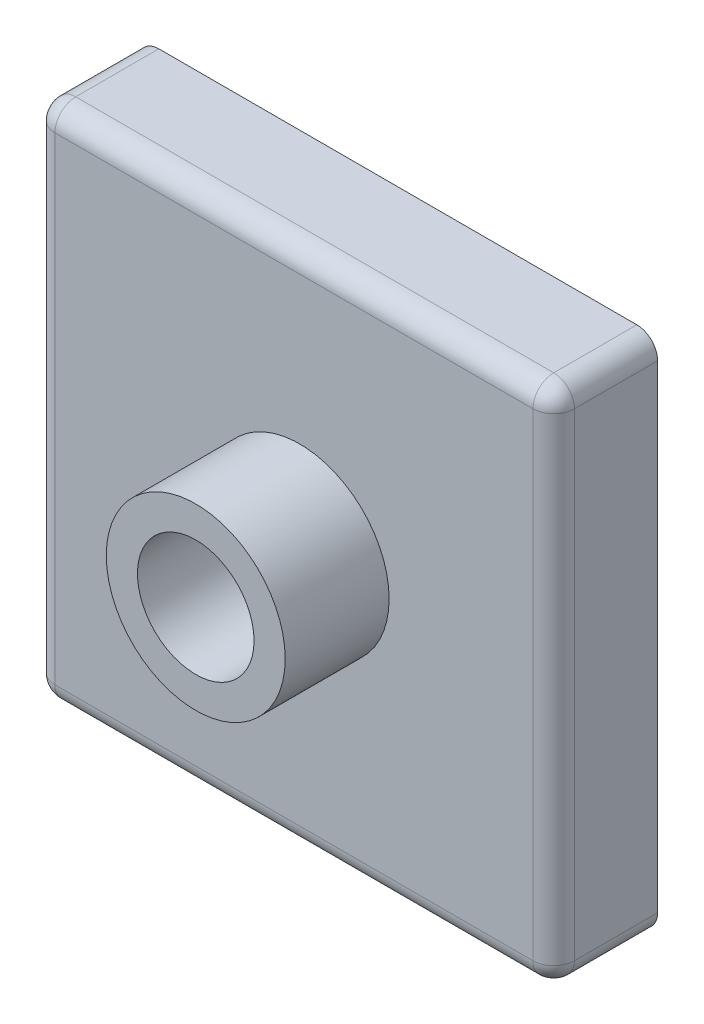
ISO-10303-21;
HEADER;
FILE_DESCRIPTION(('STEP AP214'),'2;1');
FILE_NAME('part.step','',(''),(''),'','','');
FILE_SCHEMA(('AUTOMOTIVE_DESIGN { 1 0 10303 214 1 1 1 1 }'));
ENDSEC;
DATA;
#1=APPLICATION_CONTEXT('core data for automotive mechanical design processes');
#2=APPLICATION_PROTOCOL_DEFINITION('international standard','automotive_design',2000,#1);
#3=PRODUCT_CONTEXT('',#1,'mechanical');
#4=PRODUCT('Part','Part','',(#3));
#5=PRODUCT_RELATED_PRODUCT_CATEGORY('part','',(#4));
#6=PRODUCT_DEFINITION_FORMATION('','',#4);
#7=PRODUCT_DEFINITION_CONTEXT('part definition',#1,'design');
#8=PRODUCT_DEFINITION('design','',#6,#7);
#9=PRODUCT_DEFINITION_SHAPE('','',#8);
#10=(LENGTH_UNIT() NAMED_UNIT(*) SI_UNIT(.MILLI.,.METRE.));
#11=(NAMED_UNIT(*) PLANE_ANGLE_UNIT() SI_UNIT($,.RADIAN.));
#12=(NAMED_UNIT(*) SI_UNIT($,.STERADIAN.) SOLID_ANGLE_UNIT());
#13=UNCERTAINTY_MEASURE_WITH_UNIT(LENGTH_MEASURE(1.E-05),#10,'distance_accuracy_value','');
#14=(GEOMETRIC_REPRESENTATION_CONTEXT(3) GLOBAL_UNCERTAINTY_ASSIGNED_CONTEXT((#13)) GLOBAL_UNIT_ASSIGNED_CONTEXT((#10,
#11,#12)) REPRESENTATION_CONTEXT('',''));
#15=CARTESIAN_POINT('',(0.,0.,0.));
#16=DIRECTION('',(0.,0.,1.));
#17=DIRECTION('',(1.,0.,0.));
#18=AXIS2_PLACEMENT_3D('',#15,#16,#17);
#19=CARTESIAN_POINT('',(0.,0.,0.));
#20=DIRECTION('',(0.,0.,1.));
#21=DIRECTION('',(1.,0.,0.));
#22=AXIS2_PLACEMENT_3D('',#19,#20,#21);
#23=PLANE('',#22);
#24=CARTESIAN_POINT('',(649.005386852934,-628.872643251847,0.));
#25=DIRECTION('',(0.,0.,1.));
#26=DIRECTION('',(1.,0.,0.));
#27=AXIS2_PLACEMENT_3D('',#24,#25,#26);
#28=CIRCLE('',#27,142.494070862623);
#29=CARTESIAN_POINT('',(791.499457715558,-628.872643251847,0.));
#30=VERTEX_POINT('',#29);
#31=EDGE_CURVE('E206',#30,#30,#28,.T.);
#32=ORIENTED_EDGE('',*,*,#31,.T.);
#33=EDGE_LOOP('',(#32));
#34=FACE_BOUND('',#33,.T.);
#35=CARTESIAN_POINT('',(649.005386852934,-628.872643251847,0.));
#36=DIRECTION('',(0.,0.,1.));
#37=DIRECTION('',(1.,0.,0.));
#38=AXIS2_PLACEMENT_3D('',#35,#36,#37);
#39=CIRCLE('',#38,218.694070862623);
#40=CARTESIAN_POINT('',(867.699457715558,-628.872643251847,0.));
#41=VERTEX_POINT('',#40);
#42=EDGE_CURVE('E191',#41,#41,#39,.T.);
#43=ORIENTED_EDGE('',*,*,#42,.F.);
#44=EDGE_LOOP('',(#43));
#45=FACE_BOUND('',#44,.T.);
#46=ADVANCED_FACE('F41',(#34,#45),#23,.F.);
#47=CARTESIAN_POINT('',(0.,0.,254.));
#48=DIRECTION('',(1.,0.,0.));
#49=DIRECTION('',(0.,1.,0.));
#50=AXIS2_PLACEMENT_3D('',#47,#48,#49);
#51=PLANE('',#50);
#52=DIRECTION('',(0.,-1.,0.));
#53=VECTOR('',#52,1.);
#54=CARTESIAN_POINT('',(0.,-50.8,203.2));
#55=LINE('',#54,#53);
#56=CARTESIAN_POINT('',(1.49308937752045E-13,-1219.2,203.2));
#57=VERTEX_POINT('',#56);
#58=CARTESIAN_POINT('',(0.,-50.8,203.2));
#59=VERTEX_POINT('',#58);
#60=EDGE_CURVE('E294',#57,#59,#55,.F.);
#61=ORIENTED_EDGE('',*,*,#60,.T.);
#62=DIRECTION('',(0.,0.,-1.));
#63=VECTOR('',#62,1.);
#64=CARTESIAN_POINT('',(0.,-50.8,254.));
#65=LINE('',#64,#63);
#66=CARTESIAN_POINT('',(0.,-50.8,0.));
#67=VERTEX_POINT('',#66);
#68=EDGE_CURVE('E307',#59,#67,#65,.T.);
#69=ORIENTED_EDGE('',*,*,#68,.T.);
#70=DIRECTION('',(0.,-1.,0.));
#71=VECTOR('',#70,1.);
#72=CARTESIAN_POINT('',(0.,0.,0.));
#73=LINE('',#72,#71);
#74=CARTESIAN_POINT('',(1.49308937752045E-13,-1219.2,0.));
#75=VERTEX_POINT('',#74);
#76=EDGE_CURVE('E218',#67,#75,#73,.T.);
#77=ORIENTED_EDGE('',*,*,#76,.T.);
#78=DIRECTION('',(0.,0.,-1.));
#79=VECTOR('',#78,1.);
#80=CARTESIAN_POINT('',(1.49308937752045E-13,-1219.2,254.));
#81=LINE('',#80,#79);
#82=EDGE_CURVE('E304',#75,#57,#81,.F.);
#83=ORIENTED_EDGE('',*,*,#82,.T.);
#84=EDGE_LOOP('',(#61,#69,#77,#83));
#85=FACE_BOUND('',#84,.T.);
#86=ADVANCED_FACE('F400',(#85),#51,.F.);
#87=CARTESIAN_POINT('',(1.55530143491714E-13,-1270.,254.));
#88=DIRECTION('',(0.,1.,0.));
#89=DIRECTION('',(0.,0.,1.));
#90=AXIS2_PLACEMENT_3D('',#87,#88,#89);
#91=PLANE('',#90);
#92=DIRECTION('',(1.,0.,0.));
#93=VECTOR('',#92,1.);
#94=CARTESIAN_POINT('',(1.55530143491714E-13,-1270.,203.2));
#95=LINE('',#94,#93);
#96=CARTESIAN_POINT('',(1219.2,-1270.,203.2));
#97=VERTEX_POINT('',#96);
#98=CARTESIAN_POINT('',(50.8000000000002,-1270.,203.2));
#99=VERTEX_POINT('',#98);
#100=EDGE_CURVE('E281',#97,#99,#95,.F.);
#101=ORIENTED_EDGE('',*,*,#100,.T.);
#102=DIRECTION('',(0.,0.,-1.));
#103=VECTOR('',#102,1.);
#104=CARTESIAN_POINT('',(50.8000000000002,-1270.,254.));
#105=LINE('',#104,#103);
#106=CARTESIAN_POINT('',(50.8000000000001,-1270.,0.));
#107=VERTEX_POINT('',#106);
#108=EDGE_CURVE('E323',#99,#107,#105,.T.);
#109=ORIENTED_EDGE('',*,*,#108,.T.);
#110=DIRECTION('',(1.,0.,0.));
#111=VECTOR('',#110,1.);
#112=CARTESIAN_POINT('',(1.55530143491714E-13,-1270.,0.));
#113=LINE('',#112,#111);
#114=CARTESIAN_POINT('',(1219.2,-1270.,0.));
#115=VERTEX_POINT('',#114);
#116=EDGE_CURVE('E229',#107,#115,#113,.T.);
#117=ORIENTED_EDGE('',*,*,#116,.T.);
#118=DIRECTION('',(0.,0.,-1.));
#119=VECTOR('',#118,1.);
#120=CARTESIAN_POINT('',(1219.2,-1270.,254.));
#121=LINE('',#120,#119);
#122=EDGE_CURVE('E285',#115,#97,#121,.F.);
#123=ORIENTED_EDGE('',*,*,#122,.T.);
#124=EDGE_LOOP('',(#101,#109,#117,#123));
#125=FACE_BOUND('',#124,.T.);
#126=ADVANCED_FACE('F352',(#125),#91,.F.);
#127=CARTESIAN_POINT('',(1270.,0.,254.));
#128=DIRECTION('',(-1.,0.,0.));
#129=DIRECTION('',(0.,-1.,0.));
#130=AXIS2_PLACEMENT_3D('',#127,#128,#129);
#131=PLANE('',#130);
#132=DIRECTION('',(0.,1.,0.));
#133=VECTOR('',#132,1.);
#134=CARTESIAN_POINT('',(1270.,-1270.,203.2));
#135=LINE('',#134,#133);
#136=CARTESIAN_POINT('',(1270.,-50.8,203.2));
#137=VERTEX_POINT('',#136);
#138=CARTESIAN_POINT('',(1270.,-1219.2,203.2));
#139=VERTEX_POINT('',#138);
#140=EDGE_CURVE('E240',#137,#139,#135,.F.);
#141=ORIENTED_EDGE('',*,*,#140,.T.);
#142=DIRECTION('',(0.,0.,-1.));
#143=VECTOR('',#142,1.);
#144=CARTESIAN_POINT('',(1270.,-1219.2,254.));
#145=LINE('',#144,#143);
#146=CARTESIAN_POINT('',(1270.,-1219.2,0.));
#147=VERTEX_POINT('',#146);
#148=EDGE_CURVE('E265',#139,#147,#145,.T.);
#149=ORIENTED_EDGE('',*,*,#148,.T.);
#150=DIRECTION('',(0.,1.,0.));
#151=VECTOR('',#150,1.);
#152=CARTESIAN_POINT('',(1270.,0.,0.));
#153=LINE('',#152,#151);
#154=CARTESIAN_POINT('',(1270.,-50.8,0.));
#155=VERTEX_POINT('',#154);
#156=EDGE_CURVE('E232',#147,#155,#153,.T.);
#157=ORIENTED_EDGE('',*,*,#156,.T.);
#158=DIRECTION('',(0.,0.,-1.));
#159=VECTOR('',#158,1.);
#160=CARTESIAN_POINT('',(1270.,-50.8,254.));
#161=LINE('',#160,#159);
#162=EDGE_CURVE('E255',#155,#137,#161,.F.);
#163=ORIENTED_EDGE('',*,*,#162,.T.);
#164=EDGE_LOOP('',(#141,#149,#157,#163));
#165=FACE_BOUND('',#164,.T.);
#166=ADVANCED_FACE('F375',(#165),#131,.F.);
#167=CARTESIAN_POINT('',(0.,0.,254.));
#168=DIRECTION('',(0.,-1.,0.));
#169=DIRECTION('',(0.,0.,-1.));
#170=AXIS2_PLACEMENT_3D('',#167,#168,#169);
#171=PLANE('',#170);
#172=DIRECTION('',(-1.,0.,0.));
#173=VECTOR('',#172,1.);
#174=CARTESIAN_POINT('',(0.,0.,0.));
#175=LINE('',#174,#173);
#176=CARTESIAN_POINT('',(1219.2,0.,0.));
#177=VERTEX_POINT('',#176);
#178=CARTESIAN_POINT('',(50.8,0.,0.));
#179=VERTEX_POINT('',#178);
#180=EDGE_CURVE('E225',#177,#179,#175,.T.);
#181=ORIENTED_EDGE('',*,*,#180,.T.);
#182=DIRECTION('',(0.,0.,-1.));
#183=VECTOR('',#182,1.);
#184=CARTESIAN_POINT('',(50.8,0.,254.));
#185=LINE('',#184,#183);
#186=CARTESIAN_POINT('',(50.8,0.,203.2));
#187=VERTEX_POINT('',#186);
#188=EDGE_CURVE('E317',#179,#187,#185,.F.);
#189=ORIENTED_EDGE('',*,*,#188,.T.);
#190=DIRECTION('',(-1.,0.,0.));
#191=VECTOR('',#190,1.);
#192=CARTESIAN_POINT('',(1219.2,0.,203.2));
#193=LINE('',#192,#191);
#194=CARTESIAN_POINT('',(1219.2,0.,203.2));
#195=VERTEX_POINT('',#194);
#196=EDGE_CURVE('E244',#187,#195,#193,.F.);
#197=ORIENTED_EDGE('',*,*,#196,.T.);
#198=DIRECTION('',(0.,0.,-1.));
#199=VECTOR('',#198,1.);
#200=CARTESIAN_POINT('',(1219.2,0.,254.));
#201=LINE('',#200,#199);
#202=EDGE_CURVE('E247',#195,#177,#201,.T.);
#203=ORIENTED_EDGE('',*,*,#202,.T.);
#204=EDGE_LOOP('',(#181,#189,#197,#203));
#205=FACE_BOUND('',#204,.T.);
#206=ADVANCED_FACE('F403',(#205),#171,.F.);
#207=CARTESIAN_POINT('',(0.,0.,254.));
#208=DIRECTION('',(0.,0.,1.));
#209=DIRECTION('',(1.,0.,0.));
#210=AXIS2_PLACEMENT_3D('',#207,#208,#209);
#211=PLANE('',#210);
#212=CARTESIAN_POINT('',(649.005386852934,-628.872643251847,254.000000000019));
#213=DIRECTION('',(0.,0.,1.));
#214=DIRECTION('',(1.,0.,0.));
#215=AXIS2_PLACEMENT_3D('',#212,#213,#214);
#216=CIRCLE('',#215,218.694070862623);
#217=CARTESIAN_POINT('',(867.699457715558,-628.872643251847,254.000000000019));
#218=VERTEX_POINT('',#217);
#219=EDGE_CURVE('E220',#218,#218,#216,.T.);
#220=ORIENTED_EDGE('',*,*,#219,.F.);
#221=EDGE_LOOP('',(#220));
#222=FACE_BOUND('',#221,.T.);
#223=DIRECTION('',(-1.,0.,0.));
#224=VECTOR('',#223,1.);
#225=CARTESIAN_POINT('',(0.,-50.8,254.));
#226=LINE('',#225,#224);
#227=CARTESIAN_POINT('',(1219.2,-50.8,254.));
#228=VERTEX_POINT('',#227);
#229=CARTESIAN_POINT('',(50.8,-50.8,254.));
#230=VERTEX_POINT('',#229);
#231=EDGE_CURVE('E262',#228,#230,#226,.T.);
#232=ORIENTED_EDGE('',*,*,#231,.T.);
#233=DIRECTION('',(0.,-1.,0.));
#234=VECTOR('',#233,1.);
#235=CARTESIAN_POINT('',(50.8000000000002,-1219.2,254.));
#236=LINE('',#235,#234);
#237=CARTESIAN_POINT('',(50.8000000000002,-1219.2,254.));
#238=VERTEX_POINT('',#237);
#239=EDGE_CURVE('E11',#230,#238,#236,.T.);
#240=ORIENTED_EDGE('',*,*,#239,.T.);
#241=DIRECTION('',(1.,0.,0.));
#242=VECTOR('',#241,1.);
#243=CARTESIAN_POINT('',(1219.2,-1219.2,254.));
#244=LINE('',#243,#242);
#245=CARTESIAN_POINT('',(1219.2,-1219.2,254.));
#246=VERTEX_POINT('',#245);
#247=EDGE_CURVE('E291',#238,#246,#244,.T.);
#248=ORIENTED_EDGE('',*,*,#247,.T.);
#249=DIRECTION('',(0.,1.,0.));
#250=VECTOR('',#249,1.);
#251=CARTESIAN_POINT('',(1219.2,0.,254.));
#252=LINE('',#251,#250);
#253=EDGE_CURVE('E224',#246,#228,#252,.T.);
#254=ORIENTED_EDGE('',*,*,#253,.T.);
#255=EDGE_LOOP('',(#232,#240,#248,#254));
#256=FACE_BOUND('',#255,.T.);
#257=ADVANCED_FACE('F389',(#222,#256),#211,.T.);
#258=DIRECTION('',(-1.,0.,0.));
#259=VECTOR('',#258,1.);
#260=CARTESIAN_POINT('',(0.,-76.2,0.));
#261=LINE('',#260,#259);
#262=CARTESIAN_POINT('',(1193.8,-76.2,0.));
#263=VERTEX_POINT('',#262);
#264=CARTESIAN_POINT('',(76.2,-76.2,0.));
#265=VERTEX_POINT('',#264);
#266=EDGE_CURVE('E185',#263,#265,#261,.T.);
#267=ORIENTED_EDGE('',*,*,#266,.T.);
#268=DIRECTION('',(0.,-1.,0.));
#269=VECTOR('',#268,1.);
#270=CARTESIAN_POINT('',(76.2,0.,0.));
#271=LINE('',#270,#269);
#272=CARTESIAN_POINT('',(76.2000000000002,-1193.8,0.));
#273=VERTEX_POINT('',#272);
#274=EDGE_CURVE('E170',#265,#273,#271,.T.);
#275=ORIENTED_EDGE('',*,*,#274,.T.);
#276=DIRECTION('',(1.,0.,0.));
#277=VECTOR('',#276,1.);
#278=CARTESIAN_POINT('',(1.55530143491714E-13,-1193.8,0.));
#279=LINE('',#278,#277);
#280=CARTESIAN_POINT('',(1193.8,-1193.8,0.));
#281=VERTEX_POINT('',#280);
#282=EDGE_CURVE('E190',#273,#281,#279,.T.);
#283=ORIENTED_EDGE('',*,*,#282,.T.);
#284=DIRECTION('',(0.,1.,0.));
#285=VECTOR('',#284,1.);
#286=CARTESIAN_POINT('',(1193.8,0.,0.));
#287=LINE('',#286,#285);
#288=EDGE_CURVE('E59',#281,#263,#287,.T.);
#289=ORIENTED_EDGE('',*,*,#288,.T.);
#290=EDGE_LOOP('',(#267,#275,#283,#289));
#291=FACE_BOUND('',#290,.T.);
#292=ORIENTED_EDGE('',*,*,#76,.F.);
#293=CARTESIAN_POINT('',(50.8,-50.8,0.));
#294=DIRECTION('',(0.,0.,1.));
#295=DIRECTION('',(1.,0.,0.));
#296=AXIS2_PLACEMENT_3D('',#293,#294,#295);
#297=CIRCLE('',#296,50.8);
#298=EDGE_CURVE('E314',#67,#179,#297,.F.);
#299=ORIENTED_EDGE('',*,*,#298,.T.);
#300=ORIENTED_EDGE('',*,*,#180,.F.);
#301=CARTESIAN_POINT('',(1219.2,-50.8,0.));
#302=DIRECTION('',(0.,0.,1.));
#303=DIRECTION('',(1.,0.,0.));
#304=AXIS2_PLACEMENT_3D('',#301,#302,#303);
#305=CIRCLE('',#304,50.8);
#306=EDGE_CURVE('E251',#177,#155,#305,.F.);
#307=ORIENTED_EDGE('',*,*,#306,.T.);
#308=ORIENTED_EDGE('',*,*,#156,.F.);
#309=CARTESIAN_POINT('',(1219.2,-1219.2,0.));
#310=DIRECTION('',(0.,0.,1.));
#311=DIRECTION('',(1.,0.,0.));
#312=AXIS2_PLACEMENT_3D('',#309,#310,#311);
#313=CIRCLE('',#312,50.8);
#314=EDGE_CURVE('E277',#147,#115,#313,.F.);
#315=ORIENTED_EDGE('',*,*,#314,.T.);
#316=ORIENTED_EDGE('',*,*,#116,.F.);
#317=CARTESIAN_POINT('',(50.8000000000002,-1219.2,0.));
#318=DIRECTION('',(0.,0.,1.));
#319=DIRECTION('',(1.,0.,0.));
#320=AXIS2_PLACEMENT_3D('',#317,#318,#319);
#321=CIRCLE('',#320,50.8);
#322=EDGE_CURVE('E311',#107,#75,#321,.F.);
#323=ORIENTED_EDGE('',*,*,#322,.T.);
#324=EDGE_LOOP('',(#292,#299,#300,#307,#308,#315,#316,#323));
#325=FACE_BOUND('',#324,.T.);
#326=ADVANCED_FACE('F356',(#291,#325),#23,.F.);
#327=CARTESIAN_POINT('',(649.005386852934,-628.872643251847,508.000000000019));
#328=DIRECTION('',(0.,0.,-1.));
#329=DIRECTION('',(-1.,0.,0.));
#330=AXIS2_PLACEMENT_3D('',#327,#328,#329);
#331=CYLINDRICAL_SURFACE('',#330,218.694070862623);
#332=CARTESIAN_POINT('',(649.005386852934,-628.872643251847,508.000000000019));
#333=DIRECTION('',(0.,0.,1.));
#334=DIRECTION('',(1.,0.,0.));
#335=AXIS2_PLACEMENT_3D('',#332,#333,#334);
#336=CIRCLE('',#335,218.694070862623);
#337=CARTESIAN_POINT('',(867.699457715558,-628.872643251847,508.000000000019));
#338=VERTEX_POINT('',#337);
#339=EDGE_CURVE('E214',#338,#338,#336,.T.);
#340=ORIENTED_EDGE('',*,*,#339,.F.);
#341=EDGE_LOOP('',(#340));
#342=FACE_BOUND('',#341,.T.);
#343=ORIENTED_EDGE('',*,*,#219,.T.);
#344=EDGE_LOOP('',(#343));
#345=FACE_BOUND('',#344,.T.);
#346=ADVANCED_FACE('F422',(#342,#345),#331,.T.);
#347=CARTESIAN_POINT('',(649.005386852934,-628.872643251847,508.000000000019));
#348=DIRECTION('',(0.,0.,1.));
#349=DIRECTION('',(1.,0.,0.));
#350=AXIS2_PLACEMENT_3D('',#347,#348,#349);
#351=PLANE('',#350);
#352=CARTESIAN_POINT('',(649.005386852934,-628.872643251847,508.000000000019));
#353=DIRECTION('',(0.,0.,1.));
#354=DIRECTION('',(1.,0.,0.));
#355=AXIS2_PLACEMENT_3D('',#352,#353,#354);
#356=CIRCLE('',#355,142.494070862623);
#357=CARTESIAN_POINT('',(791.499457715558,-628.872643251847,508.000000000019));
#358=VERTEX_POINT('',#357);
#359=EDGE_CURVE('E205',#358,#358,#356,.T.);
#360=ORIENTED_EDGE('',*,*,#359,.F.);
#361=EDGE_LOOP('',(#360));
#362=FACE_BOUND('',#361,.T.);
#363=ORIENTED_EDGE('',*,*,#339,.T.);
#364=EDGE_LOOP('',(#363));
#365=FACE_BOUND('',#364,.T.);
#366=ADVANCED_FACE('F427',(#362,#365),#351,.T.);
#367=CARTESIAN_POINT('',(1219.2,2.1316282072803E-13,203.2));
#368=DIRECTION('',(0.,-1.,0.));
#369=DIRECTION('',(1.,0.,0.));
#370=AXIS2_PLACEMENT_3D('',#367,#368,#369);
#371=CYLINDRICAL_SURFACE('',#370,50.8);
#372=ORIENTED_EDGE('',*,*,#253,.F.);
#373=CARTESIAN_POINT('',(1219.2,-1219.2,203.2));
#374=DIRECTION('',(0.,-1.,0.));
#375=DIRECTION('',(1.,0.,0.));
#376=AXIS2_PLACEMENT_3D('',#373,#374,#375);
#377=CIRCLE('',#376,50.8);
#378=EDGE_CURVE('E288',#246,#139,#377,.F.);
#379=ORIENTED_EDGE('',*,*,#378,.T.);
#380=ORIENTED_EDGE('',*,*,#140,.F.);
#381=CARTESIAN_POINT('',(1219.2,-50.8,203.2));
#382=DIRECTION('',(0.,-1.,0.));
#383=DIRECTION('',(1.,0.,0.));
#384=AXIS2_PLACEMENT_3D('',#381,#382,#383);
#385=CIRCLE('',#384,50.8);
#386=EDGE_CURVE('E258',#137,#228,#385,.T.);
#387=ORIENTED_EDGE('',*,*,#386,.T.);
#388=EDGE_LOOP('',(#372,#379,#380,#387));
#389=FACE_BOUND('',#388,.T.);
#390=ADVANCED_FACE('F372',(#389),#371,.T.);
#391=CARTESIAN_POINT('',(0.,-50.8,203.2));
#392=DIRECTION('',(1.,0.,0.));
#393=DIRECTION('',(0.,0.,-1.));
#394=AXIS2_PLACEMENT_3D('',#391,#392,#393);
#395=CYLINDRICAL_SURFACE('',#394,50.8);
#396=ORIENTED_EDGE('',*,*,#196,.F.);
#397=CARTESIAN_POINT('',(50.8,-50.8,203.2));
#398=DIRECTION('',(1.,0.,0.));
#399=DIRECTION('',(0.,0.,-1.));
#400=AXIS2_PLACEMENT_3D('',#397,#398,#399);
#401=CIRCLE('',#400,50.8);
#402=EDGE_CURVE('E320',#187,#230,#401,.T.);
#403=ORIENTED_EDGE('',*,*,#402,.T.);
#404=ORIENTED_EDGE('',*,*,#231,.F.);
#405=CARTESIAN_POINT('',(1219.2,-50.8,203.2));
#406=DIRECTION('',(1.,0.,0.));
#407=DIRECTION('',(0.,0.,-1.));
#408=AXIS2_PLACEMENT_3D('',#405,#406,#407);
#409=CIRCLE('',#408,50.8);
#410=EDGE_CURVE('E219',#195,#228,#409,.T.);
#411=ORIENTED_EDGE('',*,*,#410,.F.);
#412=EDGE_LOOP('',(#396,#403,#404,#411));
#413=FACE_BOUND('',#412,.T.);
#414=ADVANCED_FACE('F387',(#413),#395,.T.);
#415=CARTESIAN_POINT('',(1219.2,-50.8,203.2));
#416=DIRECTION('',(0.,-1.,0.));
#417=DIRECTION('',(0.,0.,-1.));
#418=AXIS2_PLACEMENT_3D('',#415,#416,#417);
#419=SPHERICAL_SURFACE('',#418,50.8);
#420=ORIENTED_EDGE('',*,*,#410,.T.);
#421=ORIENTED_EDGE('',*,*,#386,.F.);
#422=CARTESIAN_POINT('',(1219.2,-50.8,203.2));
#423=DIRECTION('',(0.,0.,-1.));
#424=DIRECTION('',(-1.,0.,0.));
#425=AXIS2_PLACEMENT_3D('',#422,#423,#424);
#426=CIRCLE('',#425,50.8);
#427=EDGE_CURVE('E266',#195,#137,#426,.T.);
#428=ORIENTED_EDGE('',*,*,#427,.F.);
#429=EDGE_LOOP('',(#420,#421,#428));
#430=FACE_BOUND('',#429,.T.);
#431=ADVANCED_FACE('F382',(#430),#419,.T.);
#432=CARTESIAN_POINT('',(1219.2,-50.8,254.));
#433=DIRECTION('',(0.,0.,-1.));
#434=DIRECTION('',(-1.,0.,0.));
#435=AXIS2_PLACEMENT_3D('',#432,#433,#434);
#436=CYLINDRICAL_SURFACE('',#435,50.8);
#437=ORIENTED_EDGE('',*,*,#427,.T.);
#438=ORIENTED_EDGE('',*,*,#162,.F.);
#439=ORIENTED_EDGE('',*,*,#306,.F.);
#440=ORIENTED_EDGE('',*,*,#202,.F.);
#441=EDGE_LOOP('',(#437,#438,#439,#440));
#442=FACE_BOUND('',#441,.T.);
#443=ADVANCED_FACE('F378',(#442),#436,.T.);
#444=CARTESIAN_POINT('',(0.,-1219.2,203.2));
#445=DIRECTION('',(-1.,0.,0.));
#446=DIRECTION('',(0.,0.,1.));
#447=AXIS2_PLACEMENT_3D('',#444,#445,#446);
#448=CYLINDRICAL_SURFACE('',#447,50.8);
#449=ORIENTED_EDGE('',*,*,#247,.F.);
#450=CARTESIAN_POINT('',(50.8000000000002,-1219.2,203.2));
#451=DIRECTION('',(-1.,0.,0.));
#452=DIRECTION('',(0.,0.,1.));
#453=AXIS2_PLACEMENT_3D('',#450,#451,#452);
#454=CIRCLE('',#453,50.8);
#455=EDGE_CURVE('E51',#238,#99,#454,.F.);
#456=ORIENTED_EDGE('',*,*,#455,.T.);
#457=ORIENTED_EDGE('',*,*,#100,.F.);
#458=CARTESIAN_POINT('',(1219.2,-1219.2,203.2));
#459=DIRECTION('',(1.,0.,0.));
#460=DIRECTION('',(0.,0.,-1.));
#461=AXIS2_PLACEMENT_3D('',#458,#459,#460);
#462=CIRCLE('',#461,50.8);
#463=EDGE_CURVE('E270',#246,#97,#462,.T.);
#464=ORIENTED_EDGE('',*,*,#463,.F.);
#465=EDGE_LOOP('',(#449,#456,#457,#464));
#466=FACE_BOUND('',#465,.T.);
#467=ADVANCED_FACE('F365',(#466),#448,.T.);
#468=CARTESIAN_POINT('',(1219.2,-1219.2,203.2));
#469=DIRECTION('',(0.,1.,0.));
#470=DIRECTION('',(0.,0.,1.));
#471=AXIS2_PLACEMENT_3D('',#468,#469,#470);
#472=SPHERICAL_SURFACE('',#471,50.8);
#473=ORIENTED_EDGE('',*,*,#378,.F.);
#474=ORIENTED_EDGE('',*,*,#463,.T.);
#475=CARTESIAN_POINT('',(1219.2,-1219.2,203.2));
#476=DIRECTION('',(0.,0.,-1.));
#477=DIRECTION('',(-1.,0.,0.));
#478=AXIS2_PLACEMENT_3D('',#475,#476,#477);
#479=CIRCLE('',#478,50.8);
#480=EDGE_CURVE('E295',#139,#97,#479,.T.);
#481=ORIENTED_EDGE('',*,*,#480,.F.);
#482=EDGE_LOOP('',(#473,#474,#481));
#483=FACE_BOUND('',#482,.T.);
#484=ADVANCED_FACE('F368',(#483),#472,.T.);
#485=CARTESIAN_POINT('',(1219.2,-1219.2,254.));
#486=DIRECTION('',(0.,0.,-1.));
#487=DIRECTION('',(-1.,0.,0.));
#488=AXIS2_PLACEMENT_3D('',#485,#486,#487);
#489=CYLINDRICAL_SURFACE('',#488,50.8);
#490=ORIENTED_EDGE('',*,*,#480,.T.);
#491=ORIENTED_EDGE('',*,*,#122,.F.);
#492=ORIENTED_EDGE('',*,*,#314,.F.);
#493=ORIENTED_EDGE('',*,*,#148,.F.);
#494=EDGE_LOOP('',(#490,#491,#492,#493));
#495=FACE_BOUND('',#494,.T.);
#496=ADVANCED_FACE('F361',(#495),#489,.T.);
#497=CARTESIAN_POINT('',(50.8000000000002,-1219.2,254.));
#498=DIRECTION('',(0.,0.,-1.));
#499=DIRECTION('',(-1.,0.,0.));
#500=AXIS2_PLACEMENT_3D('',#497,#498,#499);
#501=CYLINDRICAL_SURFACE('',#500,50.8);
#502=ORIENTED_EDGE('',*,*,#322,.F.);
#503=ORIENTED_EDGE('',*,*,#108,.F.);
#504=CARTESIAN_POINT('',(50.8000000000002,-1219.2,203.2));
#505=DIRECTION('',(0.,0.,1.));
#506=DIRECTION('',(1.,0.,0.));
#507=AXIS2_PLACEMENT_3D('',#504,#505,#506);
#508=CIRCLE('',#507,50.8);
#509=EDGE_CURVE('E45',#57,#99,#508,.T.);
#510=ORIENTED_EDGE('',*,*,#509,.F.);
#511=ORIENTED_EDGE('',*,*,#82,.F.);
#512=EDGE_LOOP('',(#502,#503,#510,#511));
#513=FACE_BOUND('',#512,.T.);
#514=ADVANCED_FACE('F43',(#513),#501,.T.);
#515=CARTESIAN_POINT('',(50.8000000000002,-1219.2,203.2));
#516=DIRECTION('',(1.,0.,0.));
#517=DIRECTION('',(0.,1.,0.));
#518=AXIS2_PLACEMENT_3D('',#515,#516,#517);
#519=SPHERICAL_SURFACE('',#518,50.8);
#520=ORIENTED_EDGE('',*,*,#509,.T.);
#521=ORIENTED_EDGE('',*,*,#455,.F.);
#522=CARTESIAN_POINT('',(50.8000000000002,-1219.2,203.2));
#523=DIRECTION('',(0.,1.,0.));
#524=DIRECTION('',(0.,0.,1.));
#525=AXIS2_PLACEMENT_3D('',#522,#523,#524);
#526=CIRCLE('',#525,50.8);
#527=EDGE_CURVE('E334',#57,#238,#526,.T.);
#528=ORIENTED_EDGE('',*,*,#527,.F.);
#529=EDGE_LOOP('',(#520,#521,#528));
#530=FACE_BOUND('',#529,.T.);
#531=ADVANCED_FACE('F345',(#530),#519,.T.);
#532=CARTESIAN_POINT('',(50.8,0.,203.2));
#533=DIRECTION('',(0.,1.,0.));
#534=DIRECTION('',(-1.,0.,0.));
#535=AXIS2_PLACEMENT_3D('',#532,#533,#534);
#536=CYLINDRICAL_SURFACE('',#535,50.8);
#537=ORIENTED_EDGE('',*,*,#527,.T.);
#538=ORIENTED_EDGE('',*,*,#239,.F.);
#539=CARTESIAN_POINT('',(50.8,-50.8,203.2));
#540=DIRECTION('',(0.,1.,0.));
#541=DIRECTION('',(-1.,0.,0.));
#542=AXIS2_PLACEMENT_3D('',#539,#540,#541);
#543=CIRCLE('',#542,50.8);
#544=EDGE_CURVE('E331',#59,#230,#543,.T.);
#545=ORIENTED_EDGE('',*,*,#544,.F.);
#546=ORIENTED_EDGE('',*,*,#60,.F.);
#547=EDGE_LOOP('',(#537,#538,#545,#546));
#548=FACE_BOUND('',#547,.T.);
#549=ADVANCED_FACE('F391',(#548),#536,.T.);
#550=CARTESIAN_POINT('',(50.8,-50.8,203.2));
#551=DIRECTION('',(1.,0.,0.));
#552=DIRECTION('',(0.,1.,0.));
#553=AXIS2_PLACEMENT_3D('',#550,#551,#552);
#554=SPHERICAL_SURFACE('',#553,50.8);
#555=ORIENTED_EDGE('',*,*,#544,.T.);
#556=ORIENTED_EDGE('',*,*,#402,.F.);
#557=CARTESIAN_POINT('',(50.8,-50.8,203.2));
#558=DIRECTION('',(0.,0.,-1.));
#559=DIRECTION('',(-1.,0.,0.));
#560=AXIS2_PLACEMENT_3D('',#557,#558,#559);
#561=CIRCLE('',#560,50.8);
#562=EDGE_CURVE('E210',#59,#187,#561,.T.);
#563=ORIENTED_EDGE('',*,*,#562,.F.);
#564=EDGE_LOOP('',(#555,#556,#563));
#565=FACE_BOUND('',#564,.T.);
#566=ADVANCED_FACE('F394',(#565),#554,.T.);
#567=CARTESIAN_POINT('',(50.8,-50.8,254.));
#568=DIRECTION('',(0.,0.,-1.));
#569=DIRECTION('',(-1.,0.,0.));
#570=AXIS2_PLACEMENT_3D('',#567,#568,#569);
#571=CYLINDRICAL_SURFACE('',#570,50.8);
#572=ORIENTED_EDGE('',*,*,#562,.T.);
#573=ORIENTED_EDGE('',*,*,#188,.F.);
#574=ORIENTED_EDGE('',*,*,#298,.F.);
#575=ORIENTED_EDGE('',*,*,#68,.F.);
#576=EDGE_LOOP('',(#572,#573,#574,#575));
#577=FACE_BOUND('',#576,.T.);
#578=ADVANCED_FACE('F398',(#577),#571,.T.);
#579=CARTESIAN_POINT('',(649.005386852934,-628.872643251847,0.));
#580=DIRECTION('',(0.,0.,1.));
#581=DIRECTION('',(1.,0.,0.));
#582=AXIS2_PLACEMENT_3D('',#579,#580,#581);
#583=CYLINDRICAL_SURFACE('',#582,142.494070862623);
#584=ORIENTED_EDGE('',*,*,#31,.F.);
#585=EDGE_LOOP('',(#584));
#586=FACE_BOUND('',#585,.T.);
#587=ORIENTED_EDGE('',*,*,#359,.T.);
#588=EDGE_LOOP('',(#587));
#589=FACE_BOUND('',#588,.T.);
#590=ADVANCED_FACE('F447',(#586,#589),#583,.F.);
#591=CARTESIAN_POINT('',(0.,0.,177.8));
#592=DIRECTION('',(0.,0.,1.));
#593=DIRECTION('',(1.,0.,0.));
#594=AXIS2_PLACEMENT_3D('',#591,#592,#593);
#595=PLANE('',#594);
#596=DIRECTION('',(-1.,0.,0.));
#597=VECTOR('',#596,1.);
#598=CARTESIAN_POINT('',(0.,-76.2,177.8));
#599=LINE('',#598,#597);
#600=CARTESIAN_POINT('',(1193.8,-76.2,177.8));
#601=VERTEX_POINT('',#600);
#602=CARTESIAN_POINT('',(76.2,-76.2,177.8));
#603=VERTEX_POINT('',#602);
#604=EDGE_CURVE('E149',#601,#603,#599,.T.);
#605=ORIENTED_EDGE('',*,*,#604,.F.);
#606=DIRECTION('',(0.,-1.,0.));
#607=VECTOR('',#606,1.);
#608=CARTESIAN_POINT('',(1193.8,2.08721928629529E-13,177.8));
#609=LINE('',#608,#607);
#610=CARTESIAN_POINT('',(1193.8,-1193.8,177.8));
#611=VERTEX_POINT('',#610);
#612=EDGE_CURVE('E182',#601,#611,#609,.T.);
#613=ORIENTED_EDGE('',*,*,#612,.T.);
#614=DIRECTION('',(-1.,0.,0.));
#615=VECTOR('',#614,1.);
#616=CARTESIAN_POINT('',(0.,-1193.8,177.8));
#617=LINE('',#616,#615);
#618=CARTESIAN_POINT('',(76.2000000000002,-1193.8,177.8));
#619=VERTEX_POINT('',#618);
#620=EDGE_CURVE('E152',#611,#619,#617,.T.);
#621=ORIENTED_EDGE('',*,*,#620,.T.);
#622=DIRECTION('',(0.,-1.,0.));
#623=VECTOR('',#622,1.);
#624=CARTESIAN_POINT('',(76.2,0.,177.8));
#625=LINE('',#624,#623);
#626=EDGE_CURVE('E145',#603,#619,#625,.T.);
#627=ORIENTED_EDGE('',*,*,#626,.F.);
#628=EDGE_LOOP('',(#605,#613,#621,#627));
#629=FACE_BOUND('',#628,.T.);
#630=CARTESIAN_POINT('',(649.005386852934,-628.872643251847,177.8));
#631=DIRECTION('',(0.,0.,1.));
#632=DIRECTION('',(1.,0.,0.));
#633=AXIS2_PLACEMENT_3D('',#630,#631,#632);
#634=CIRCLE('',#633,218.694070862623);
#635=CARTESIAN_POINT('',(867.699457715558,-628.872643251847,177.8));
#636=VERTEX_POINT('',#635);
#637=EDGE_CURVE('E156',#636,#636,#634,.F.);
#638=ORIENTED_EDGE('',*,*,#637,.F.);
#639=EDGE_LOOP('',(#638));
#640=FACE_BOUND('',#639,.T.);
#641=ADVANCED_FACE('F147',(#629,#640),#595,.F.);
#642=CARTESIAN_POINT('',(76.2,0.,254.));
#643=DIRECTION('',(1.,0.,0.));
#644=DIRECTION('',(0.,1.,0.));
#645=AXIS2_PLACEMENT_3D('',#642,#643,#644);
#646=PLANE('',#645);
#647=ORIENTED_EDGE('',*,*,#626,.T.);
#648=DIRECTION('',(0.,0.,-1.));
#649=VECTOR('',#648,1.);
#650=CARTESIAN_POINT('',(76.2000000000002,-1193.8,254.));
#651=LINE('',#650,#649);
#652=EDGE_CURVE('E157',#619,#273,#651,.T.);
#653=ORIENTED_EDGE('',*,*,#652,.T.);
#654=ORIENTED_EDGE('',*,*,#274,.F.);
#655=DIRECTION('',(0.,0.,1.));
#656=VECTOR('',#655,1.);
#657=CARTESIAN_POINT('',(76.2,-76.2,254.));
#658=LINE('',#657,#656);
#659=EDGE_CURVE('E163',#265,#603,#658,.T.);
#660=ORIENTED_EDGE('',*,*,#659,.T.);
#661=EDGE_LOOP('',(#647,#653,#654,#660));
#662=FACE_BOUND('',#661,.T.);
#663=ADVANCED_FACE('F168',(#662),#646,.T.);
#664=CARTESIAN_POINT('',(1.55530143491714E-13,-1193.8,254.));
#665=DIRECTION('',(0.,1.,0.));
#666=DIRECTION('',(0.,0.,1.));
#667=AXIS2_PLACEMENT_3D('',#664,#665,#666);
#668=PLANE('',#667);
#669=ORIENTED_EDGE('',*,*,#620,.F.);
#670=DIRECTION('',(0.,0.,1.));
#671=VECTOR('',#670,1.);
#672=CARTESIAN_POINT('',(1193.8,-1193.8,254.));
#673=LINE('',#672,#671);
#674=EDGE_CURVE('E173',#281,#611,#673,.T.);
#675=ORIENTED_EDGE('',*,*,#674,.F.);
#676=ORIENTED_EDGE('',*,*,#282,.F.);
#677=ORIENTED_EDGE('',*,*,#652,.F.);
#678=EDGE_LOOP('',(#669,#675,#676,#677));
#679=FACE_BOUND('',#678,.T.);
#680=ADVANCED_FACE('F432',(#679),#668,.T.);
#681=CARTESIAN_POINT('',(1193.8,0.,254.));
#682=DIRECTION('',(-1.,0.,0.));
#683=DIRECTION('',(0.,-1.,0.));
#684=AXIS2_PLACEMENT_3D('',#681,#682,#683);
#685=PLANE('',#684);
#686=ORIENTED_EDGE('',*,*,#612,.F.);
#687=DIRECTION('',(0.,0.,1.));
#688=VECTOR('',#687,1.);
#689=CARTESIAN_POINT('',(1193.8,-76.2,254.));
#690=LINE('',#689,#688);
#691=EDGE_CURVE('E165',#263,#601,#690,.T.);
#692=ORIENTED_EDGE('',*,*,#691,.F.);
#693=ORIENTED_EDGE('',*,*,#288,.F.);
#694=ORIENTED_EDGE('',*,*,#674,.T.);
#695=EDGE_LOOP('',(#686,#692,#693,#694));
#696=FACE_BOUND('',#695,.T.);
#697=ADVANCED_FACE('F433',(#696),#685,.T.);
#698=CARTESIAN_POINT('',(0.,-76.2,254.));
#699=DIRECTION('',(0.,-1.,0.));
#700=DIRECTION('',(0.,0.,-1.));
#701=AXIS2_PLACEMENT_3D('',#698,#699,#700);
#702=PLANE('',#701);
#703=ORIENTED_EDGE('',*,*,#266,.F.);
#704=ORIENTED_EDGE('',*,*,#691,.T.);
#705=ORIENTED_EDGE('',*,*,#604,.T.);
#706=ORIENTED_EDGE('',*,*,#659,.F.);
#707=EDGE_LOOP('',(#703,#704,#705,#706));
#708=FACE_BOUND('',#707,.T.);
#709=ADVANCED_FACE('F162',(#708),#702,.T.);
#710=CARTESIAN_POINT('',(649.005386852934,-628.872643251847,0.));
#711=DIRECTION('',(0.,0.,1.));
#712=DIRECTION('',(1.,0.,0.));
#713=AXIS2_PLACEMENT_3D('',#710,#711,#712);
#714=CYLINDRICAL_SURFACE('',#713,218.694070862623);
#715=ORIENTED_EDGE('',*,*,#637,.T.);
#716=EDGE_LOOP('',(#715));
#717=FACE_BOUND('',#716,.T.);
#718=ORIENTED_EDGE('',*,*,#42,.T.);
#719=EDGE_LOOP('',(#718));
#720=FACE_BOUND('',#719,.T.);
#721=ADVANCED_FACE('F440',(#717,#720),#714,.T.);
#722=CLOSED_SHELL('',(#46,#86,#126,#166,#206,#257,#326,#346,#366,#390,#414,#431,#443,#467,#484,
#496,#514,#531,#549,#566,#578,#590,#641,#663,#680,#697,#709,#721));
#723=MANIFOLD_SOLID_BREP('B2',#722);
#724=ADVANCED_BREP_SHAPE_REPRESENTATION('',(#18,#723),#14);
#725=SHAPE_DEFINITION_REPRESENTATION(#9,#724);
ENDSEC;
END-ISO-10303-21;
